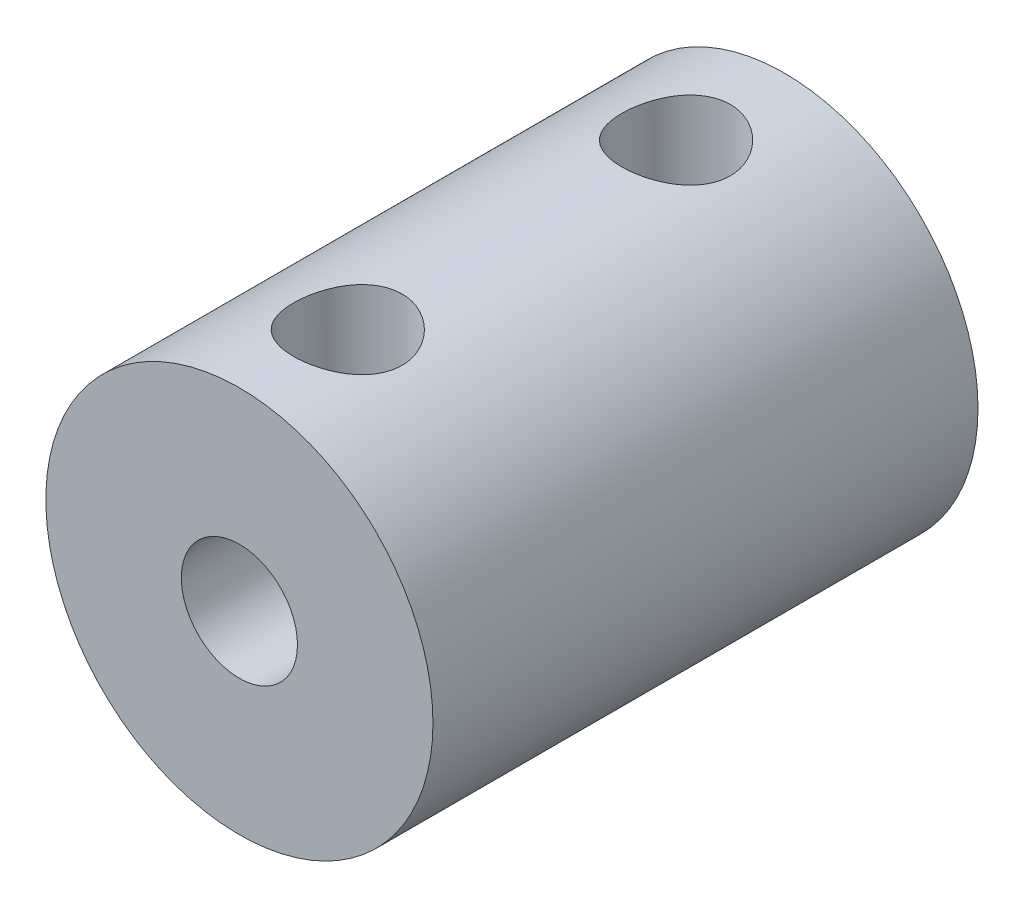
ISO-10303-21;
HEADER;
FILE_DESCRIPTION(('STEP AP214'),'2;1');
FILE_NAME('part.step','',(''),(''),'','','');
FILE_SCHEMA(('AUTOMOTIVE_DESIGN { 1 0 10303 214 1 1 1 1 }'));
ENDSEC;
DATA;
#1=APPLICATION_CONTEXT('core data for automotive mechanical design processes');
#2=APPLICATION_PROTOCOL_DEFINITION('international standard','automotive_design',2000,#1);
#3=PRODUCT_CONTEXT('',#1,'mechanical');
#4=PRODUCT('Part','Part','',(#3));
#5=PRODUCT_RELATED_PRODUCT_CATEGORY('part','',(#4));
#6=PRODUCT_DEFINITION_FORMATION('','',#4);
#7=PRODUCT_DEFINITION_CONTEXT('part definition',#1,'design');
#8=PRODUCT_DEFINITION('design','',#6,#7);
#9=PRODUCT_DEFINITION_SHAPE('','',#8);
#10=(LENGTH_UNIT() NAMED_UNIT(*) SI_UNIT(.MILLI.,.METRE.));
#11=(NAMED_UNIT(*) PLANE_ANGLE_UNIT() SI_UNIT($,.RADIAN.));
#12=(NAMED_UNIT(*) SI_UNIT($,.STERADIAN.) SOLID_ANGLE_UNIT());
#13=UNCERTAINTY_MEASURE_WITH_UNIT(LENGTH_MEASURE(1.E-05),#10,'distance_accuracy_value','');
#14=(GEOMETRIC_REPRESENTATION_CONTEXT(3) GLOBAL_UNCERTAINTY_ASSIGNED_CONTEXT((#13)) GLOBAL_UNIT_ASSIGNED_CONTEXT((#10,
#11,#12)) REPRESENTATION_CONTEXT('',''));
#15=CARTESIAN_POINT('',(0.,0.,0.));
#16=DIRECTION('',(0.,0.,1.));
#17=DIRECTION('',(1.,0.,0.));
#18=AXIS2_PLACEMENT_3D('',#15,#16,#17);
#19=CARTESIAN_POINT('',(0.,0.,22.352));
#20=DIRECTION('',(0.,0.,-1.));
#21=DIRECTION('',(-1.,0.,0.));
#22=AXIS2_PLACEMENT_3D('',#19,#20,#21);
#23=CYLINDRICAL_SURFACE('',#22,7.9375);
#24=CARTESIAN_POINT('',(0.,0.,22.352));
#25=DIRECTION('',(0.,0.,1.));
#26=DIRECTION('',(1.,0.,0.));
#27=AXIS2_PLACEMENT_3D('',#24,#25,#26);
#28=CIRCLE('',#27,7.9375);
#29=CARTESIAN_POINT('',(7.9375,0.,22.352));
#30=VERTEX_POINT('',#29);
#31=EDGE_CURVE('E12',#30,#30,#28,.T.);
#32=ORIENTED_EDGE('',*,*,#31,.F.);
#33=EDGE_LOOP('',(#32));
#34=FACE_BOUND('',#33,.T.);
#35=CARTESIAN_POINT('',(0.,0.,0.));
#36=DIRECTION('',(0.,0.,1.));
#37=DIRECTION('',(1.,0.,0.));
#38=AXIS2_PLACEMENT_3D('',#35,#36,#37);
#39=CIRCLE('',#38,7.9375);
#40=CARTESIAN_POINT('',(7.9375,0.,0.));
#41=VERTEX_POINT('',#40);
#42=EDGE_CURVE('E54',#41,#41,#39,.T.);
#43=ORIENTED_EDGE('',*,*,#42,.T.);
#44=EDGE_LOOP('',(#43));
#45=FACE_BOUND('',#44,.T.);
#46=CARTESIAN_POINT('',(0.,7.9375,2.2225));
#47=CARTESIAN_POINT('',(-0.122289434384592,7.93749841297143,2.222502398111));
#48=CARTESIAN_POINT('',(-0.24460380457482,7.93464640374844,2.23262687587564));
#49=CARTESIAN_POINT('',(-0.485694032880113,7.92354674957216,2.27277621242458));
#50=CARTESIAN_POINT('',(-0.60446842009344,7.91529689355351,2.30280922620723));
#51=CARTESIAN_POINT('',(-0.834964927090246,7.89430957331477,2.38171141204331));
#52=CARTESIAN_POINT('',(-0.946696414251323,7.88157822480584,2.43055492267656));
#53=CARTESIAN_POINT('',(-1.16038287672983,7.85296472583047,2.54559251715216));
#54=CARTESIAN_POINT('',(-1.26233693946535,7.83708228167832,2.61178821842334));
#55=CARTESIAN_POINT('',(-1.45615831068255,7.8034232726709,2.76142117544705));
#56=CARTESIAN_POINT('',(-1.54774260219952,7.78561177508401,2.84521716527189));
#57=CARTESIAN_POINT('',(-1.71575936348891,7.75032012250063,3.02690611080194));
#58=CARTESIAN_POINT('',(-1.79218966338291,7.73284001527906,3.12480108186052));
#59=CARTESIAN_POINT('',(-1.92915068426256,7.6998283677456,3.33422041664797));
#60=CARTESIAN_POINT('',(-1.98934817384267,7.68434065377252,3.44597026361879));
#61=CARTESIAN_POINT('',(-2.08998548271767,7.65758432116579,3.67850943858364));
#62=CARTESIAN_POINT('',(-2.13042936410227,7.64631483521622,3.79929690220516));
#63=CARTESIAN_POINT('',(-2.18941388458174,7.62963290719132,4.0433305685353));
#64=CARTESIAN_POINT('',(-2.20847108866752,7.62408261047198,4.16644225208111));
#65=CARTESIAN_POINT('',(-2.22575284029697,7.61905627706929,4.41423081639444));
#66=CARTESIAN_POINT('',(-2.22398171731977,7.61957897802232,4.53890736649888));
#67=CARTESIAN_POINT('',(-2.20006548936518,7.62651666080719,4.78219088560423));
#68=CARTESIAN_POINT('',(-2.17855378119358,7.63274845031214,4.90086618923935));
#69=CARTESIAN_POINT('',(-2.1167849227819,7.65010764560777,5.13285161633766));
#70=CARTESIAN_POINT('',(-2.0765261380634,7.66123547825911,5.24616127104343));
#71=CARTESIAN_POINT('',(-1.97790928071366,7.68728817952527,5.46581036825138));
#72=CARTESIAN_POINT('',(-1.9193356539467,7.7022578670799,5.57204749092034));
#73=CARTESIAN_POINT('',(-1.78590192518265,7.73428447505437,5.77340348293651));
#74=CARTESIAN_POINT('',(-1.71103832459554,7.75134184349961,5.86851995715068));
#75=CARTESIAN_POINT('',(-1.54394699344826,7.78637689551321,6.04854369025916));
#76=CARTESIAN_POINT('',(-1.45118970763094,7.80436556600566,6.13295804958312));
#77=CARTESIAN_POINT('',(-1.25261337987339,7.83868636973626,6.2851397189066));
#78=CARTESIAN_POINT('',(-1.14679371362257,7.85501842372916,6.35290623276662));
#79=CARTESIAN_POINT('',(-0.924282134935336,7.88430398837012,6.47011680307549));
#80=CARTESIAN_POINT('',(-0.807536626467184,7.89723951739796,6.51946390275543));
#81=CARTESIAN_POINT('',(-0.566959944436844,7.91814489748872,6.59768456648585));
#82=CARTESIAN_POINT('',(-0.443130491451456,7.92611594879985,6.62656307940385));
#83=CARTESIAN_POINT('',(-0.196101124919305,7.93600949314591,6.66223492193407));
#84=CARTESIAN_POINT('',(-0.0730050493447826,7.93811522289107,6.66969753237384));
#85=CARTESIAN_POINT('',(0.172682576611987,7.93657184147866,6.66418471081962));
#86=CARTESIAN_POINT('',(0.295274183312976,7.9329233912093,6.65121162593874));
#87=CARTESIAN_POINT('',(0.534031051075131,7.92040063357283,6.60574190820065));
#88=CARTESIAN_POINT('',(0.650274552968655,7.91162815516481,6.57362546036324));
#89=CARTESIAN_POINT('',(0.875707417570525,7.88985924413703,6.49122831272659));
#90=CARTESIAN_POINT('',(0.984895977260916,7.87686233168934,6.44094554945293));
#91=CARTESIAN_POINT('',(1.19566699168485,7.84766549897653,6.32244786332019));
#92=CARTESIAN_POINT('',(1.29704110514929,7.83140394678713,6.25387794200882));
#93=CARTESIAN_POINT('',(1.48707642789286,7.79755361828553,6.10119270156045));
#94=CARTESIAN_POINT('',(1.57573485369032,7.77996455266095,6.01707398796685));
#95=CARTESIAN_POINT('',(1.74069277960931,7.74475574438945,5.83254542583976));
#96=CARTESIAN_POINT('',(1.81651823498446,7.72715229446269,5.73170785802765));
#97=CARTESIAN_POINT('',(1.95019062299679,7.69450550823917,5.51836192472094));
#98=CARTESIAN_POINT('',(2.00803822741068,7.67946207629195,5.40585399552126));
#99=CARTESIAN_POINT('',(2.10368464486661,7.65381415280244,5.17286166057826));
#100=CARTESIAN_POINT('',(2.14159346282923,7.64318537493625,5.05242523518426));
#101=CARTESIAN_POINT('',(2.19651019045085,7.62758676285093,4.80653384499789));
#102=CARTESIAN_POINT('',(2.21352412253003,7.62261529808532,4.68108033702155));
#103=CARTESIAN_POINT('',(2.22579634337424,7.61904009677965,4.43359578431933));
#104=CARTESIAN_POINT('',(2.22182051126849,7.62021218162667,4.31160541699017));
#105=CARTESIAN_POINT('',(2.19402262129698,7.6282616577072,4.07010880845293));
#106=CARTESIAN_POINT('',(2.17020117735789,7.63513887245171,3.95060249051765));
#107=CARTESIAN_POINT('',(2.10385266467513,7.65368348699787,3.71854127422839));
#108=CARTESIAN_POINT('',(2.06150355593924,7.66530524566887,3.6059315866381));
#109=CARTESIAN_POINT('',(1.95943946415649,7.69202662666681,3.38932773685296));
#110=CARTESIAN_POINT('',(1.89972151088259,7.70712684374916,3.28533505215382));
#111=CARTESIAN_POINT('',(1.76236009307517,7.73971061356866,3.08530033200027));
#112=CARTESIAN_POINT('',(1.68420156559259,7.75725523110183,2.98962190181763));
#113=CARTESIAN_POINT('',(1.51313678633054,7.79242812441293,2.81249007152221));
#114=CARTESIAN_POINT('',(1.42022686792809,7.81005641993032,2.73104021868081));
#115=CARTESIAN_POINT('',(1.21957214778867,7.84392363107764,2.5827194350652));
#116=CARTESIAN_POINT('',(1.11152155583987,7.86011833953724,2.51625116374675));
#117=CARTESIAN_POINT('',(0.885326940704656,7.88879340490492,2.40252470486394));
#118=CARTESIAN_POINT('',(0.767188780236338,7.90127590062755,2.35525544990178));
#119=CARTESIAN_POINT('',(0.541420338472194,7.91970568495603,2.28669956819758));
#120=CARTESIAN_POINT('',(0.434666257171261,7.92632747266372,2.26268411699767));
#121=CARTESIAN_POINT('',(0.218614550898745,7.93522507389311,2.23058423476692));
#122=CARTESIAN_POINT('',(0.109317238511548,7.93750141868005,2.22249785627538));
#123=CARTESIAN_POINT('',(0.,7.9375,2.2225));
#124=B_SPLINE_CURVE_WITH_KNOTS('',3,(#46,#47,#48,#49,#50,#51,#52,#53,#54,#55,#56,#57,#58,#59,
#60,#61,#62,#63,#64,#65,#66,#67,#68,#69,#70,#71,#72,#73,#74,#75,#76,#77,#78,#79,#80,#81,#82,#83,
#84,#85,#86,#87,#88,#89,#90,#91,#92,#93,#94,#95,#96,#97,#98,#99,#100,#101,#102,#103,#104,#105,
#106,#107,#108,#109,#110,#111,#112,#113,#114,#115,#116,#117,#118,#119,#120,#121,#122,#123),
.UNSPECIFIED.,.T.,.F.,(4,2,2,2,2,2,2,2,2,2,2,2,2,2,2,2,2,2,2,2,2,2,2,2,2,2,2,2,2,2,2,2,2,2,2,2,
2,2,4),(0.,0.366467159375125,0.733084525040348,1.09920351015625,1.46535663402203,
1.83985902232483,2.2144149964241,2.59615815397005,2.97782277758453,3.35005588802573,
3.72221162561857,4.08282869463252,4.44347721021375,4.80854112418707,5.17368352028811,
5.55201589839115,5.93036636572644,6.310681224658,6.69090410017637,7.05910769208849,
7.42726899757707,7.78835148351942,8.14947499698045,8.51819575160419,8.88699709692384,
9.26734918477583,9.64768705833693,10.0259039435842,10.4040117918163,10.7684207028235,
11.1328183412108,11.4937902180729,11.8548238606708,12.2274771315308,12.6002231749544,
12.9820329052775,13.3636222254502,13.6912554080105,14.0188485322216),.UNSPECIFIED.);
#125=CARTESIAN_POINT('',(0.,7.9375,2.2225));
#126=VERTEX_POINT('',#125);
#127=EDGE_CURVE('E69',#126,#126,#124,.T.);
#128=ORIENTED_EDGE('',*,*,#127,.F.);
#129=EDGE_LOOP('',(#128));
#130=FACE_BOUND('',#129,.T.);
#131=CARTESIAN_POINT('',(0.,7.9375,15.6845));
#132=CARTESIAN_POINT('',(-0.122289434384591,7.93749841297143,15.684502398111));
#133=CARTESIAN_POINT('',(-0.244603804574819,7.93464640374844,15.6946268758756));
#134=CARTESIAN_POINT('',(-0.485694032880112,7.92354674957216,15.7347762124246));
#135=CARTESIAN_POINT('',(-0.604468420093439,7.91529689355351,15.7648092262072));
#136=CARTESIAN_POINT('',(-0.834964927090245,7.89430957331477,15.8437114120433));
#137=CARTESIAN_POINT('',(-0.946696414251322,7.88157822480584,15.8925549226766));
#138=CARTESIAN_POINT('',(-1.16038287672983,7.85296472583047,16.0075925171522));
#139=CARTESIAN_POINT('',(-1.26233693946535,7.83708228167832,16.0737882184233));
#140=CARTESIAN_POINT('',(-1.45615831068255,7.8034232726709,16.223421175447));
#141=CARTESIAN_POINT('',(-1.54774260219952,7.78561177508401,16.3072171652719));
#142=CARTESIAN_POINT('',(-1.7157593634889,7.75032012250063,16.4889061108019));
#143=CARTESIAN_POINT('',(-1.79218966338291,7.73284001527906,16.5868010818605));
#144=CARTESIAN_POINT('',(-1.92915068426256,7.6998283677456,16.796220416648));
#145=CARTESIAN_POINT('',(-1.98934817384267,7.68434065377252,16.9079702636188));
#146=CARTESIAN_POINT('',(-2.08998548271766,7.65758432116579,17.1405094385836));
#147=CARTESIAN_POINT('',(-2.13042936410227,7.64631483521622,17.2612969022052));
#148=CARTESIAN_POINT('',(-2.18941388458174,7.62963290719132,17.5053305685353));
#149=CARTESIAN_POINT('',(-2.20847108866751,7.62408261047198,17.6284422520811));
#150=CARTESIAN_POINT('',(-2.22575284029697,7.61905627706929,17.8762308163944));
#151=CARTESIAN_POINT('',(-2.22398171731976,7.61957897802232,18.0009073664989));
#152=CARTESIAN_POINT('',(-2.20006548936518,7.62651666080719,18.2441908856042));
#153=CARTESIAN_POINT('',(-2.17855378119358,7.63274845031214,18.3628661892393));
#154=CARTESIAN_POINT('',(-2.1167849227819,7.65010764560777,18.5948516163377));
#155=CARTESIAN_POINT('',(-2.07652613806339,7.66123547825911,18.7081612710434));
#156=CARTESIAN_POINT('',(-1.97790928071366,7.68728817952527,18.9278103682514));
#157=CARTESIAN_POINT('',(-1.9193356539467,7.7022578670799,19.0340474909203));
#158=CARTESIAN_POINT('',(-1.78590192518265,7.73428447505437,19.2354034829365));
#159=CARTESIAN_POINT('',(-1.71103832459554,7.75134184349961,19.3305199571507));
#160=CARTESIAN_POINT('',(-1.54394699344826,7.78637689551321,19.5105436902592));
#161=CARTESIAN_POINT('',(-1.45118970763094,7.80436556600566,19.5949580495831));
#162=CARTESIAN_POINT('',(-1.25261337987339,7.83868636973626,19.7471397189066));
#163=CARTESIAN_POINT('',(-1.14679371362257,7.85501842372916,19.8149062327666));
#164=CARTESIAN_POINT('',(-0.924282134935334,7.88430398837012,19.9321168030755));
#165=CARTESIAN_POINT('',(-0.807536626467182,7.89723951739796,19.9814639027554));
#166=CARTESIAN_POINT('',(-0.566959944436842,7.91814489748872,20.0596845664858));
#167=CARTESIAN_POINT('',(-0.443130491451454,7.92611594879985,20.0885630794039));
#168=CARTESIAN_POINT('',(-0.196101124919303,7.93600949314591,20.1242349219341));
#169=CARTESIAN_POINT('',(-0.073005049344781,7.93811522289107,20.1316975323738));
#170=CARTESIAN_POINT('',(0.172682576611989,7.93657184147866,20.1261847108196));
#171=CARTESIAN_POINT('',(0.295274183312978,7.9329233912093,20.1132116259387));
#172=CARTESIAN_POINT('',(0.534031051075135,7.92040063357283,20.0677419082006));
#173=CARTESIAN_POINT('',(0.65027455296866,7.91162815516481,20.0356254603632));
#174=CARTESIAN_POINT('',(0.875707417570529,7.88985924413703,19.9532283127266));
#175=CARTESIAN_POINT('',(0.984895977260919,7.87686233168934,19.9029455494529));
#176=CARTESIAN_POINT('',(1.19566699168485,7.84766549897653,19.7844478633202));
#177=CARTESIAN_POINT('',(1.2970411051493,7.83140394678713,19.7158779420088));
#178=CARTESIAN_POINT('',(1.48707642789286,7.79755361828553,19.5631927015604));
#179=CARTESIAN_POINT('',(1.57573485369032,7.77996455266095,19.4790739879668));
#180=CARTESIAN_POINT('',(1.74069277960931,7.74475574438944,19.2945454258398));
#181=CARTESIAN_POINT('',(1.81651823498446,7.72715229446269,19.1937078580276));
#182=CARTESIAN_POINT('',(1.95019062299679,7.69450550823917,18.9803619247209));
#183=CARTESIAN_POINT('',(2.00803822741068,7.67946207629195,18.8678539955213));
#184=CARTESIAN_POINT('',(2.10368464486661,7.65381415280244,18.6348616605783));
#185=CARTESIAN_POINT('',(2.14159346282924,7.64318537493625,18.5144252351843));
#186=CARTESIAN_POINT('',(2.19651019045085,7.62758676285093,18.2685338449979));
#187=CARTESIAN_POINT('',(2.21352412253003,7.62261529808532,18.1430803370216));
#188=CARTESIAN_POINT('',(2.22579634337424,7.61904009677965,17.8955957843193));
#189=CARTESIAN_POINT('',(2.22182051126849,7.62021218162667,17.7736054169902));
#190=CARTESIAN_POINT('',(2.19402262129698,7.6282616577072,17.5321088084529));
#191=CARTESIAN_POINT('',(2.1702011773579,7.63513887245171,17.4126024905176));
#192=CARTESIAN_POINT('',(2.10385266467514,7.65368348699787,17.1805412742284));
#193=CARTESIAN_POINT('',(2.06150355593924,7.66530524566887,17.0679315866381));
#194=CARTESIAN_POINT('',(1.95943946415649,7.69202662666681,16.851327736853));
#195=CARTESIAN_POINT('',(1.89972151088259,7.70712684374916,16.7473350521538));
#196=CARTESIAN_POINT('',(1.76236009307517,7.73971061356866,16.5473003320003));
#197=CARTESIAN_POINT('',(1.68420156559259,7.75725523110183,16.4516219018176));
#198=CARTESIAN_POINT('',(1.51313678633054,7.79242812441293,16.2744900715222));
#199=CARTESIAN_POINT('',(1.42022686792809,7.81005641993032,16.1930402186808));
#200=CARTESIAN_POINT('',(1.21957214778867,7.84392363107764,16.0447194350652));
#201=CARTESIAN_POINT('',(1.11152155583987,7.86011833953724,15.9782511637467));
#202=CARTESIAN_POINT('',(0.885326940704655,7.88879340490492,15.8645247048639));
#203=CARTESIAN_POINT('',(0.767188780236338,7.90127590062755,15.8172554499018));
#204=CARTESIAN_POINT('',(0.541420338472195,7.91970568495603,15.7486995681976));
#205=CARTESIAN_POINT('',(0.434666257171261,7.92632747266372,15.7246841169977));
#206=CARTESIAN_POINT('',(0.218614550898745,7.93522507389311,15.6925842347669));
#207=CARTESIAN_POINT('',(0.109317238511548,7.93750141868005,15.6844978562754));
#208=CARTESIAN_POINT('',(0.,7.9375,15.6845));
#209=B_SPLINE_CURVE_WITH_KNOTS('',3,(#131,#132,#133,#134,#135,#136,#137,#138,#139,#140,#141,
#142,#143,#144,#145,#146,#147,#148,#149,#150,#151,#152,#153,#154,#155,#156,#157,#158,#159,#160,
#161,#162,#163,#164,#165,#166,#167,#168,#169,#170,#171,#172,#173,#174,#175,#176,#177,#178,#179,
#180,#181,#182,#183,#184,#185,#186,#187,#188,#189,#190,#191,#192,#193,#194,#195,#196,#197,#198,
#199,#200,#201,#202,#203,#204,#205,#206,#207,#208),.UNSPECIFIED.,.T.,.F.,(4,2,2,2,2,2,2,2,2,2,2,
2,2,2,2,2,2,2,2,2,2,2,2,2,2,2,2,2,2,2,2,2,2,2,2,2,2,2,4),(0.,0.366467159375125,
0.733084525040349,1.09920351015625,1.46535663402203,1.83985902232483,2.2144149964241,
2.59615815397005,2.97782277758453,3.35005588802573,3.72221162561857,4.08282869463253,
4.44347721021375,4.80854112418707,5.17368352028811,5.55201589839115,5.93036636572644,
6.310681224658,6.69090410017637,7.05910769208849,7.42726899757707,7.78835148351942,
8.14947499698046,8.5181957516042,8.88699709692385,9.26734918477583,9.64768705833693,
10.0259039435842,10.4040117918163,10.7684207028235,11.1328183412108,11.4937902180729,
11.8548238606708,12.2274771315308,12.6002231749544,12.9820329052775,13.3636222254502,
13.6912554080105,14.0188485322216),.UNSPECIFIED.);
#210=CARTESIAN_POINT('',(0.,7.9375,15.6845));
#211=VERTEX_POINT('',#210);
#212=EDGE_CURVE('E70',#211,#211,#209,.T.);
#213=ORIENTED_EDGE('',*,*,#212,.F.);
#214=EDGE_LOOP('',(#213));
#215=FACE_BOUND('',#214,.T.);
#216=ADVANCED_FACE('F42',(#34,#45,#130,#215),#23,.T.);
#217=CARTESIAN_POINT('',(0.,0.,0.));
#218=DIRECTION('',(0.,0.,1.));
#219=DIRECTION('',(1.,0.,0.));
#220=AXIS2_PLACEMENT_3D('',#217,#218,#219);
#221=CYLINDRICAL_SURFACE('',#220,2.38125);
#222=CARTESIAN_POINT('',(0.,2.38125,2.2225));
#223=CARTESIAN_POINT('',(0.10175093640361,2.38124703022677,2.22250300685196));
#224=CARTESIAN_POINT('',(0.203522692147452,2.37467420005168,2.22954117476645));
#225=CARTESIAN_POINT('',(0.403592509755524,2.34897030551855,2.25711507726185));
#226=CARTESIAN_POINT('',(0.501888097944402,2.32983048061234,2.27766022767637));
#227=CARTESIAN_POINT('',(0.691600173612992,2.28070009975167,2.33056315654022));
#228=CARTESIAN_POINT('',(0.783055845182337,2.2507781661883,2.36284624075312));
#229=CARTESIAN_POINT('',(0.958129046007172,2.18201795301847,2.43737379150318));
#230=CARTESIAN_POINT('',(1.04174466527685,2.14317750860066,2.47962067664505));
#231=CARTESIAN_POINT('',(1.23251028258521,2.0413763640653,2.59106374385985));
#232=CARTESIAN_POINT('',(1.33550632105848,1.9750128476514,2.66424971401401));
#233=CARTESIAN_POINT('',(1.52451121031219,1.83309773958082,2.82305647482055));
#234=CARTESIAN_POINT('',(1.61046222352526,1.75751622413426,2.9087179484772));
#235=CARTESIAN_POINT('',(1.73687732809426,1.63046052625932,3.05633586758315));
#236=CARTESIAN_POINT('',(1.78239490885965,1.58043124405963,3.11531429219639));
#237=CARTESIAN_POINT('',(1.86705504965452,1.47945784622329,3.23706083207311));
#238=CARTESIAN_POINT('',(1.90619289486492,1.42851308461185,3.29983170353551));
#239=CARTESIAN_POINT('',(1.97807638343489,1.32718255402696,3.42903961233565));
#240=CARTESIAN_POINT('',(2.01083804174594,1.2767956923735,3.49546691252317));
#241=CARTESIAN_POINT('',(2.07005973751693,1.17833762917068,3.63263119045582));
#242=CARTESIAN_POINT('',(2.0965281993105,1.13026340143066,3.70336224579459));
#243=CARTESIAN_POINT('',(2.1361140257618,1.05293591867363,3.82896508584095));
#244=CARTESIAN_POINT('',(2.15087387186558,1.02228255734714,3.88244627631111));
#245=CARTESIAN_POINT('',(2.17675520249747,0.965940986895705,3.99283622507745));
#246=CARTESIAN_POINT('',(2.18788124040624,0.940246580554252,4.0497405871722));
#247=CARTESIAN_POINT('',(2.20409764813081,0.901477078263094,4.15564993773872));
#248=CARTESIAN_POINT('',(2.20994884415512,0.886907772156764,4.20397039303806));
#249=CARTESIAN_POINT('',(2.21847420981416,0.865369450668072,4.302500809186));
#250=CARTESIAN_POINT('',(2.22115779507425,0.858377915686602,4.35270471017004));
#251=CARTESIAN_POINT('',(2.2230615673394,0.853439995647803,4.45399283173746));
#252=CARTESIAN_POINT('',(2.2222584448165,0.855554485926306,4.5050806958763));
#253=CARTESIAN_POINT('',(2.21723973887413,0.868470483796378,4.60600965295542));
#254=CARTESIAN_POINT('',(2.21301616018428,0.879292344365349,4.65584754238874));
#255=CARTESIAN_POINT('',(2.19903300274284,0.913823347824142,4.77482924305952));
#256=CARTESIAN_POINT('',(2.18764593870351,0.941124954195303,4.84269025265034));
#257=CARTESIAN_POINT('',(2.15975186362473,1.00349291124993,4.97367770643234));
#258=CARTESIAN_POINT('',(2.14322249950858,1.03859296684691,5.03678195613209));
#259=CARTESIAN_POINT('',(2.10426708479824,1.11553059057773,5.16351470200321));
#260=CARTESIAN_POINT('',(2.08150041482621,1.15767212997307,5.22684953385439));
#261=CARTESIAN_POINT('',(2.03099570790849,1.24415673741467,5.34998200473649));
#262=CARTESIAN_POINT('',(2.00325290075974,1.28850188812607,5.40977617582737));
#263=CARTESIAN_POINT('',(1.9428096023593,1.37795587124386,5.52634594123569));
#264=CARTESIAN_POINT('',(1.91010265994262,1.42306562853032,5.58311747586937));
#265=CARTESIAN_POINT('',(1.83969796232473,1.51298640617418,5.69372568976607));
#266=CARTESIAN_POINT('',(1.80200002256375,1.55779741541991,5.74756226039443));
#267=CARTESIAN_POINT('',(1.71810055207976,1.65005586497754,5.85664974219327));
#268=CARTESIAN_POINT('',(1.67145077533637,1.69740871180895,5.91163979426498));
#269=CARTESIAN_POINT('',(1.57201183669742,1.78990494594871,6.01776397837092));
#270=CARTESIAN_POINT('',(1.51922066661582,1.83504760364828,6.06889684007448));
#271=CARTESIAN_POINT('',(1.35170197347936,1.96548883310393,6.21539318146275));
#272=CARTESIAN_POINT('',(1.22738241819897,2.04631555316656,6.30445063226099));
#273=CARTESIAN_POINT('',(1.00747021032518,2.15967549730076,6.4283542277097));
#274=CARTESIAN_POINT('',(0.919474347033364,2.19877280463021,6.47082128879185));
#275=CARTESIAN_POINT('',(0.735270787699571,2.26701098288164,6.54469002252412));
#276=CARTESIAN_POINT('',(0.639068972438682,2.29615891031522,6.57609953814054));
#277=CARTESIAN_POINT('',(0.439711046724101,2.3425521594942,6.62600657497642));
#278=CARTESIAN_POINT('',(0.336506964491798,2.3597038150824,6.64440249931548));
#279=CARTESIAN_POINT('',(0.127184439534057,2.38016923890392,6.66634577623404));
#280=CARTESIAN_POINT('',(0.0210679015787514,2.3834918441466,6.66990261125923));
#281=CARTESIAN_POINT('',(-0.177916853106249,2.37643934699634,6.66234502526834));
#282=CARTESIAN_POINT('',(-0.270910080724627,2.36758989960981,6.65286471859373));
#283=CARTESIAN_POINT('',(-0.453427878738518,2.33950482769181,6.62272070657175));
#284=CARTESIAN_POINT('',(-0.542951877321729,2.32026749872593,6.60205516595977));
#285=CARTESIAN_POINT('',(-0.717660101600377,2.27236414192199,6.55044224211502));
#286=CARTESIAN_POINT('',(-0.802770241390369,2.24357541162075,6.51936099791592));
#287=CARTESIAN_POINT('',(-0.96606585274343,2.17825962930284,6.44853599467746));
#288=CARTESIAN_POINT('',(-1.04424948571521,2.14173053133712,6.40878994525967));
#289=CARTESIAN_POINT('',(-1.23016206684754,2.04279021033544,6.30049190223977));
#290=CARTESIAN_POINT('',(-1.33323828796586,1.97654393669676,6.22744647696719));
#291=CARTESIAN_POINT('',(-1.52243299636872,1.83482695766989,6.06889570116582));
#292=CARTESIAN_POINT('',(-1.60848953450069,1.75932411771221,5.98334673465722));
#293=CARTESIAN_POINT('',(-1.73511164262584,1.63234184813389,5.83587153971055));
#294=CARTESIAN_POINT('',(-1.78072466062733,1.58231546854914,5.77692324630929));
#295=CARTESIAN_POINT('',(-1.86556957329411,1.4813334350545,5.65523398123252));
#296=CARTESIAN_POINT('',(-1.90479675296249,1.43037712512296,5.59249025365165));
#297=CARTESIAN_POINT('',(-1.97685228195261,1.3290081416155,5.46334117723377));
#298=CARTESIAN_POINT('',(-2.00969697437745,1.27859440034088,5.39694575429892));
#299=CARTESIAN_POINT('',(-2.06908318572349,1.1800553746365,5.25985287180625));
#300=CARTESIAN_POINT('',(-2.09563306148541,1.13192712474347,5.18916127426063));
#301=CARTESIAN_POINT('',(-2.13537479052786,1.05443792597089,5.0635952994476));
#302=CARTESIAN_POINT('',(-2.15020547948167,1.02369158874009,5.01010529939493));
#303=CARTESIAN_POINT('',(-2.17622807626879,0.967132098649388,4.89969747274186));
#304=CARTESIAN_POINT('',(-2.18742434552598,0.941313048337647,4.84278385259124));
#305=CARTESIAN_POINT('',(-2.20377786311248,0.902261704097733,4.73678884763202));
#306=CARTESIAN_POINT('',(-2.20969219824257,0.887549002470735,4.68839066818038));
#307=CARTESIAN_POINT('',(-2.21833498777709,0.865728342924982,4.58968190893422));
#308=CARTESIAN_POINT('',(-2.22107298682479,0.858597607205246,4.53937753006225));
#309=CARTESIAN_POINT('',(-2.22307107366976,0.853415791470576,4.43784982431729));
#310=CARTESIAN_POINT('',(-2.22230705506794,0.8554276443299,4.38662255307376));
#311=CARTESIAN_POINT('',(-2.21734533537028,0.868200178292049,4.28540561882749));
#312=CARTESIAN_POINT('',(-2.21313959992197,0.878981330112096,4.23541913392988));
#313=CARTESIAN_POINT('',(-2.19921774939739,0.913375472173685,4.11643663894929));
#314=CARTESIAN_POINT('',(-2.18789493086271,0.940540512607069,4.04870409515304));
#315=CARTESIAN_POINT('',(-2.16014720313488,1.00263624033578,3.91795693829437));
#316=CARTESIAN_POINT('',(-2.14370004933945,1.03760059254872,3.85496441095309));
#317=CARTESIAN_POINT('',(-2.10492929622347,1.11427411110069,3.72843930250362));
#318=CARTESIAN_POINT('',(-2.08226527920257,1.15628888969695,3.66520071018494));
#319=CARTESIAN_POINT('',(-2.03198600033109,1.24253221170509,3.54225318110689));
#320=CARTESIAN_POINT('',(-2.00436597688463,1.28676285433898,3.48254771288902));
#321=CARTESIAN_POINT('',(-1.94419006733198,1.37600101553462,3.366146292857));
#322=CARTESIAN_POINT('',(-1.9116277460786,1.4210094781506,3.3094543967545));
#323=CARTESIAN_POINT('',(-1.84153546243536,1.51074293082683,3.19899339210907));
#324=CARTESIAN_POINT('',(-1.80400530662861,1.55546790977889,3.14522439748098));
#325=CARTESIAN_POINT('',(-1.72043753004496,1.64761403020163,3.03620435726982));
#326=CARTESIAN_POINT('',(-1.67394779904264,1.69494090465768,2.98121629095965));
#327=CARTESIAN_POINT('',(-1.57484605598663,1.78740668724072,2.87507912614266));
#328=CARTESIAN_POINT('',(-1.52223203591466,1.83254487083397,2.82393129585751));
#329=CARTESIAN_POINT('',(-1.35525812345594,1.96301920267744,2.67734677450458));
#330=CARTESIAN_POINT('',(-1.2313301166566,2.04391916999333,2.58818509851484));
#331=CARTESIAN_POINT('',(-1.01184539053484,2.15763323086052,2.46386872750825));
#332=CARTESIAN_POINT('',(-0.92384940660723,2.19694458005971,2.42116251562618));
#333=CARTESIAN_POINT('',(-0.739623618938463,2.26559548680763,2.34683765535438));
#334=CARTESIAN_POINT('',(-0.643403991693722,2.29494715173861,2.31520554335917));
#335=CARTESIAN_POINT('',(-0.456725687851755,2.33876301385191,2.2680682845365));
#336=CARTESIAN_POINT('',(-0.366964280067111,2.35459240772435,2.25108191932985));
#337=CARTESIAN_POINT('',(-0.184807268304142,2.37583615764941,2.22829758444011));
#338=CARTESIAN_POINT('',(-0.0924122207069671,2.38125269720701,2.22249726911735));
#339=CARTESIAN_POINT('',(0.,2.38125,2.2225));
#340=B_SPLINE_CURVE_WITH_KNOTS('',3,(#222,#223,#224,#225,#226,#227,#228,#229,#230,#231,#232,
#233,#234,#235,#236,#237,#238,#239,#240,#241,#242,#243,#244,#245,#246,#247,#248,#249,#250,#251,
#252,#253,#254,#255,#256,#257,#258,#259,#260,#261,#262,#263,#264,#265,#266,#267,#268,#269,#270,
#271,#272,#273,#274,#275,#276,#277,#278,#279,#280,#281,#282,#283,#284,#285,#286,#287,#288,#289,
#290,#291,#292,#293,#294,#295,#296,#297,#298,#299,#300,#301,#302,#303,#304,#305,#306,#307,#308,
#309,#310,#311,#312,#313,#314,#315,#316,#317,#318,#319,#320,#321,#322,#323,#324,#325,#326,#327,
#328,#329,#330,#331,#332,#333,#334,#335,#336,#337,#338,#339),.UNSPECIFIED.,.T.,.F.,(4,2,2,2,2,2,
2,2,2,2,2,2,2,2,2,2,2,2,2,2,2,2,2,2,2,2,2,2,2,2,2,2,2,2,2,2,2,2,2,2,2,2,2,2,2,2,2,2,2,2,2,2,2,2,
2,2,2,2,4),(0.,0.304855553193616,0.609923849479403,0.913083882441653,1.21631758009444,
1.64215709590017,2.06941774424172,2.33835724760266,2.60749461308448,2.87594701116928,
3.14403799858385,3.33394461360789,3.52361234297388,3.67549714496655,3.82692932794442,
3.9793754268592,4.13217889854741,4.35300911562226,4.57481299893595,4.81269716176824,
5.05081059483546,5.28923616162671,5.52767054750953,5.78612694775913,6.04466809998172,
6.55906983427965,6.87367682425346,7.18806021604599,7.50487168782134,7.8214806803145,
8.10181768694833,8.38220070501312,8.6663349466379,8.95054438507305,9.37615145650551,
9.80328026264735,10.072299380053,10.3415162361041,10.6100343746765,10.8781940138539,
11.0683091066204,11.2581952042442,11.4104484172617,11.5622429263406,11.7150838873098,
11.8682826618373,12.0885826919461,12.3098526857321,12.547217141997,12.7848108847058,
13.022716684514,13.2606317496354,13.5187842707019,13.7770216739379,14.2908733092229,
14.6060177286276,14.9207776620294,15.1977116058563,15.4745874721748),.UNSPECIFIED.);
#341=CARTESIAN_POINT('',(0.,2.38125,2.2225));
#342=VERTEX_POINT('',#341);
#343=EDGE_CURVE('E64',#342,#342,#340,.T.);
#344=ORIENTED_EDGE('',*,*,#343,.F.);
#345=EDGE_LOOP('',(#344));
#346=FACE_BOUND('',#345,.T.);
#347=CARTESIAN_POINT('',(0.,0.,0.));
#348=DIRECTION('',(0.,0.,1.));
#349=DIRECTION('',(1.,0.,0.));
#350=AXIS2_PLACEMENT_3D('',#347,#348,#349);
#351=CIRCLE('',#350,2.38125);
#352=CARTESIAN_POINT('',(2.38125,0.,0.));
#353=VERTEX_POINT('',#352);
#354=EDGE_CURVE('E59',#353,#353,#351,.T.);
#355=ORIENTED_EDGE('',*,*,#354,.F.);
#356=EDGE_LOOP('',(#355));
#357=FACE_BOUND('',#356,.T.);
#358=CARTESIAN_POINT('',(0.,0.,22.352));
#359=DIRECTION('',(0.,0.,1.));
#360=DIRECTION('',(1.,0.,0.));
#361=AXIS2_PLACEMENT_3D('',#358,#359,#360);
#362=CIRCLE('',#361,2.38125);
#363=CARTESIAN_POINT('',(2.38125,0.,22.352));
#364=VERTEX_POINT('',#363);
#365=EDGE_CURVE('E62',#364,#364,#362,.T.);
#366=ORIENTED_EDGE('',*,*,#365,.T.);
#367=EDGE_LOOP('',(#366));
#368=FACE_BOUND('',#367,.T.);
#369=CARTESIAN_POINT('',(0.,2.38125,15.6845));
#370=CARTESIAN_POINT('',(0.101750936403611,2.38124703022677,15.684503006852));
#371=CARTESIAN_POINT('',(0.203522692147453,2.37467420005168,15.6915411747665));
#372=CARTESIAN_POINT('',(0.403592509755525,2.34897030551855,15.7191150772619));
#373=CARTESIAN_POINT('',(0.501888097944403,2.32983048061234,15.7396602276764));
#374=CARTESIAN_POINT('',(0.691600173612993,2.28070009975167,15.7925631565402));
#375=CARTESIAN_POINT('',(0.783055845182337,2.2507781661883,15.8248462407531));
#376=CARTESIAN_POINT('',(0.958129046007173,2.18201795301847,15.8993737915032));
#377=CARTESIAN_POINT('',(1.04174466527685,2.14317750860066,15.9416206766451));
#378=CARTESIAN_POINT('',(1.23251028258522,2.0413763640653,16.0530637438598));
#379=CARTESIAN_POINT('',(1.33550632105849,1.9750128476514,16.126249714014));
#380=CARTESIAN_POINT('',(1.52451121031219,1.83309773958082,16.2850564748205));
#381=CARTESIAN_POINT('',(1.61046222352526,1.75751622413426,16.3707179484772));
#382=CARTESIAN_POINT('',(1.73687732809426,1.63046052625932,16.5183358675832));
#383=CARTESIAN_POINT('',(1.78239490885965,1.58043124405963,16.5773142921964));
#384=CARTESIAN_POINT('',(1.86705504965452,1.47945784622329,16.6990608320731));
#385=CARTESIAN_POINT('',(1.90619289486492,1.42851308461184,16.7618317035355));
#386=CARTESIAN_POINT('',(1.97807638343489,1.32718255402696,16.8910396123357));
#387=CARTESIAN_POINT('',(2.01083804174594,1.2767956923735,16.9574669125232));
#388=CARTESIAN_POINT('',(2.07005973751693,1.17833762917067,17.0946311904558));
#389=CARTESIAN_POINT('',(2.0965281993105,1.13026340143066,17.1653622457946));
#390=CARTESIAN_POINT('',(2.1361140257618,1.05293591867363,17.290965085841));
#391=CARTESIAN_POINT('',(2.15087387186559,1.02228255734714,17.3444462763111));
#392=CARTESIAN_POINT('',(2.17675520249747,0.965940986895699,17.4548362250775));
#393=CARTESIAN_POINT('',(2.18788124040624,0.940246580554246,17.5117405871722));
#394=CARTESIAN_POINT('',(2.20409764813081,0.901477078263089,17.6176499377387));
#395=CARTESIAN_POINT('',(2.20994884415512,0.886907772156758,17.6659703930381));
#396=CARTESIAN_POINT('',(2.21847420981416,0.865369450668066,17.764500809186));
#397=CARTESIAN_POINT('',(2.22115779507425,0.858377915686598,17.81470471017));
#398=CARTESIAN_POINT('',(2.2230615673394,0.8534399956478,17.9159928317375));
#399=CARTESIAN_POINT('',(2.2222584448165,0.855554485926304,17.9670806958763));
#400=CARTESIAN_POINT('',(2.21723973887414,0.868470483796377,18.0680096529554));
#401=CARTESIAN_POINT('',(2.21301616018428,0.879292344365347,18.1178475423887));
#402=CARTESIAN_POINT('',(2.19903300274284,0.913823347824139,18.2368292430595));
#403=CARTESIAN_POINT('',(2.18764593870351,0.9411249541953,18.3046902526503));
#404=CARTESIAN_POINT('',(2.15975186362473,1.00349291124992,18.4356777064323));
#405=CARTESIAN_POINT('',(2.14322249950858,1.0385929668469,18.4987819561321));
#406=CARTESIAN_POINT('',(2.10426708479824,1.11553059057773,18.6255147020032));
#407=CARTESIAN_POINT('',(2.08150041482621,1.15767212997306,18.6888495338544));
#408=CARTESIAN_POINT('',(2.03099570790849,1.24415673741467,18.8119820047365));
#409=CARTESIAN_POINT('',(2.00325290075974,1.28850188812606,18.8717761758274));
#410=CARTESIAN_POINT('',(1.9428096023593,1.37795587124385,18.9883459412357));
#411=CARTESIAN_POINT('',(1.91010265994262,1.42306562853032,19.0451174758694));
#412=CARTESIAN_POINT('',(1.83969796232473,1.51298640617418,19.1557256897661));
#413=CARTESIAN_POINT('',(1.80200002256375,1.55779741541991,19.2095622603944));
#414=CARTESIAN_POINT('',(1.71810055207976,1.65005586497754,19.3186497421933));
#415=CARTESIAN_POINT('',(1.67145077533637,1.69740871180895,19.373639794265));
#416=CARTESIAN_POINT('',(1.57201183669742,1.78990494594871,19.4797639783709));
#417=CARTESIAN_POINT('',(1.51922066661582,1.83504760364828,19.5308968400745));
#418=CARTESIAN_POINT('',(1.35170197347936,1.96548883310393,19.6773931814627));
#419=CARTESIAN_POINT('',(1.22738241819898,2.04631555316656,19.766450632261));
#420=CARTESIAN_POINT('',(1.00747021032519,2.15967549730076,19.8903542277097));
#421=CARTESIAN_POINT('',(0.919474347033368,2.19877280463021,19.9328212887918));
#422=CARTESIAN_POINT('',(0.735270787699574,2.26701098288163,20.0066900225241));
#423=CARTESIAN_POINT('',(0.639068972438686,2.29615891031522,20.0380995381405));
#424=CARTESIAN_POINT('',(0.439711046724105,2.3425521594942,20.0880065749764));
#425=CARTESIAN_POINT('',(0.336506964491803,2.3597038150824,20.1064024993155));
#426=CARTESIAN_POINT('',(0.127184439534062,2.38016923890392,20.128345776234));
#427=CARTESIAN_POINT('',(0.0210679015787555,2.3834918441466,20.1319026112592));
#428=CARTESIAN_POINT('',(-0.177916853106245,2.37643934699634,20.1243450252683));
#429=CARTESIAN_POINT('',(-0.270910080724622,2.36758989960981,20.1148647185937));
#430=CARTESIAN_POINT('',(-0.453427878738514,2.33950482769181,20.0847207065717));
#431=CARTESIAN_POINT('',(-0.542951877321725,2.32026749872593,20.0640551659598));
#432=CARTESIAN_POINT('',(-0.717660101600374,2.272364141922,20.012442242115));
#433=CARTESIAN_POINT('',(-0.802770241390366,2.24357541162075,19.9813609979159));
#434=CARTESIAN_POINT('',(-0.966065852743426,2.17825962930284,19.9105359946775));
#435=CARTESIAN_POINT('',(-1.0442494857152,2.14173053133712,19.8707899452597));
#436=CARTESIAN_POINT('',(-1.23016206684753,2.04279021033545,19.7624919022398));
#437=CARTESIAN_POINT('',(-1.33323828796586,1.97654393669676,19.6894464769672));
#438=CARTESIAN_POINT('',(-1.52243299636872,1.83482695766989,19.5308957011658));
#439=CARTESIAN_POINT('',(-1.60848953450069,1.75932411771221,19.4453467346572));
#440=CARTESIAN_POINT('',(-1.73511164262584,1.63234184813389,19.2978715397105));
#441=CARTESIAN_POINT('',(-1.78072466062733,1.58231546854914,19.2389232463093));
#442=CARTESIAN_POINT('',(-1.86556957329412,1.4813334350545,19.1172339812325));
#443=CARTESIAN_POINT('',(-1.90479675296249,1.43037712512296,19.0544902536517));
#444=CARTESIAN_POINT('',(-1.97685228195261,1.3290081416155,18.9253411772338));
#445=CARTESIAN_POINT('',(-2.00969697437745,1.27859440034088,18.8589457542989));
#446=CARTESIAN_POINT('',(-2.06908318572349,1.1800553746365,18.7218528718062));
#447=CARTESIAN_POINT('',(-2.09563306148541,1.13192712474347,18.6511612742606));
#448=CARTESIAN_POINT('',(-2.13537479052786,1.0544379259709,18.5255952994476));
#449=CARTESIAN_POINT('',(-2.15020547948167,1.02369158874009,18.4721052993949));
#450=CARTESIAN_POINT('',(-2.17622807626879,0.96713209864939,18.3616974727419));
#451=CARTESIAN_POINT('',(-2.18742434552598,0.941313048337649,18.3047838525912));
#452=CARTESIAN_POINT('',(-2.20377786311248,0.902261704097735,18.198788847632));
#453=CARTESIAN_POINT('',(-2.20969219824257,0.887549002470737,18.1503906681804));
#454=CARTESIAN_POINT('',(-2.21833498777709,0.865728342924984,18.0516819089342));
#455=CARTESIAN_POINT('',(-2.22107298682479,0.858597607205249,18.0013775300622));
#456=CARTESIAN_POINT('',(-2.22307107366976,0.85341579147058,17.8998498243173));
#457=CARTESIAN_POINT('',(-2.22230705506793,0.855427644329904,17.8486225530738));
#458=CARTESIAN_POINT('',(-2.21734533537028,0.868200178292052,17.7474056188275));
#459=CARTESIAN_POINT('',(-2.21313959992197,0.878981330112099,17.6974191339299));
#460=CARTESIAN_POINT('',(-2.19921774939738,0.913375472173689,17.5784366389493));
#461=CARTESIAN_POINT('',(-2.18789493086271,0.940540512607074,17.510704095153));
#462=CARTESIAN_POINT('',(-2.16014720313488,1.00263624033579,17.3799569382944));
#463=CARTESIAN_POINT('',(-2.14370004933944,1.03760059254872,17.3169644109531));
#464=CARTESIAN_POINT('',(-2.10492929622347,1.1142741111007,17.1904393025036));
#465=CARTESIAN_POINT('',(-2.08226527920257,1.15628888969696,17.1272007101849));
#466=CARTESIAN_POINT('',(-2.03198600033109,1.2425322117051,17.0042531811069));
#467=CARTESIAN_POINT('',(-2.00436597688463,1.28676285433899,16.944547712889));
#468=CARTESIAN_POINT('',(-1.94419006733197,1.37600101553463,16.828146292857));
#469=CARTESIAN_POINT('',(-1.9116277460786,1.42100947815061,16.7714543967545));
#470=CARTESIAN_POINT('',(-1.84153546243536,1.51074293082684,16.6609933921091));
#471=CARTESIAN_POINT('',(-1.8040053066286,1.5554679097789,16.607224397481));
#472=CARTESIAN_POINT('',(-1.72043753004495,1.64761403020164,16.4982043572698));
#473=CARTESIAN_POINT('',(-1.67394779904263,1.69494090465769,16.4432162909596));
#474=CARTESIAN_POINT('',(-1.57484605598662,1.78740668724073,16.3370791261426));
#475=CARTESIAN_POINT('',(-1.52223203591465,1.83254487083398,16.2859312958575));
#476=CARTESIAN_POINT('',(-1.35525812345592,1.96301920267745,16.1393467745046));
#477=CARTESIAN_POINT('',(-1.23133011665658,2.04391916999334,16.0501850985148));
#478=CARTESIAN_POINT('',(-1.01184539053482,2.15763323086053,15.9258687275082));
#479=CARTESIAN_POINT('',(-0.923849406607213,2.19694458005972,15.8831625156262));
#480=CARTESIAN_POINT('',(-0.739623618938446,2.26559548680763,15.8088376553544));
#481=CARTESIAN_POINT('',(-0.643403991693705,2.29494715173862,15.7772055433592));
#482=CARTESIAN_POINT('',(-0.456725687851741,2.33876301385191,15.7300682845365));
#483=CARTESIAN_POINT('',(-0.366964280067101,2.35459240772435,15.7130819193298));
#484=CARTESIAN_POINT('',(-0.184807268304137,2.37583615764941,15.6902975844401));
#485=CARTESIAN_POINT('',(-0.0924122207069637,2.38125269720701,15.6844972691173));
#486=CARTESIAN_POINT('',(0.,2.38125,15.6845));
#487=B_SPLINE_CURVE_WITH_KNOTS('',3,(#369,#370,#371,#372,#373,#374,#375,#376,#377,#378,#379,
#380,#381,#382,#383,#384,#385,#386,#387,#388,#389,#390,#391,#392,#393,#394,#395,#396,#397,#398,
#399,#400,#401,#402,#403,#404,#405,#406,#407,#408,#409,#410,#411,#412,#413,#414,#415,#416,#417,
#418,#419,#420,#421,#422,#423,#424,#425,#426,#427,#428,#429,#430,#431,#432,#433,#434,#435,#436,
#437,#438,#439,#440,#441,#442,#443,#444,#445,#446,#447,#448,#449,#450,#451,#452,#453,#454,#455,
#456,#457,#458,#459,#460,#461,#462,#463,#464,#465,#466,#467,#468,#469,#470,#471,#472,#473,#474,
#475,#476,#477,#478,#479,#480,#481,#482,#483,#484,#485,#486),.UNSPECIFIED.,.T.,.F.,(4,2,2,2,2,2,
2,2,2,2,2,2,2,2,2,2,2,2,2,2,2,2,2,2,2,2,2,2,2,2,2,2,2,2,2,2,2,2,2,2,2,2,2,2,2,2,2,2,2,2,2,2,2,2,
2,2,2,2,4),(0.,0.304855553193617,0.609923849479403,0.913083882441653,1.21631758009444,
1.64215709590017,2.06941774424172,2.33835724760266,2.60749461308448,2.87594701116928,
3.14403799858386,3.3339446136079,3.52361234297389,3.67549714496656,3.82692932794443,
3.9793754268592,4.13217889854742,4.35300911562227,4.57481299893595,4.81269716176825,
5.05081059483546,5.28923616162672,5.52767054750953,5.78612694775913,6.04466809998172,
6.55906983427965,6.87367682425346,7.18806021604598,7.50487168782134,7.8214806803145,
8.10181768694833,8.38220070501312,8.66633494663789,8.95054438507305,9.37615145650551,
9.80328026264735,10.072299380053,10.3415162361042,10.6100343746765,10.8781940138539,
11.0683091066204,11.2581952042443,11.4104484172617,11.5622429263406,11.7150838873098,
11.8682826618373,12.0885826919461,12.3098526857321,12.5472171419971,12.7848108847058,
13.022716684514,13.2606317496354,13.5187842707019,13.7770216739379,14.2908733092229,
14.6060177286276,14.9207776620295,15.1977116058563,15.4745874721748),.UNSPECIFIED.);
#488=CARTESIAN_POINT('',(0.,2.38125,15.6845));
#489=VERTEX_POINT('',#488);
#490=EDGE_CURVE('E46',#489,#489,#487,.T.);
#491=ORIENTED_EDGE('',*,*,#490,.F.);
#492=EDGE_LOOP('',(#491));
#493=FACE_BOUND('',#492,.T.);
#494=ADVANCED_FACE('F71',(#346,#357,#368,#493),#221,.F.);
#495=CARTESIAN_POINT('',(0.,0.,22.352));
#496=DIRECTION('',(0.,0.,1.));
#497=DIRECTION('',(1.,0.,0.));
#498=AXIS2_PLACEMENT_3D('',#495,#496,#497);
#499=PLANE('',#498);
#500=ORIENTED_EDGE('',*,*,#365,.F.);
#501=EDGE_LOOP('',(#500));
#502=FACE_BOUND('',#501,.T.);
#503=ORIENTED_EDGE('',*,*,#31,.T.);
#504=EDGE_LOOP('',(#503));
#505=FACE_BOUND('',#504,.T.);
#506=ADVANCED_FACE('F97',(#502,#505),#499,.T.);
#507=CARTESIAN_POINT('',(0.,0.,0.));
#508=DIRECTION('',(0.,0.,1.));
#509=DIRECTION('',(1.,0.,0.));
#510=AXIS2_PLACEMENT_3D('',#507,#508,#509);
#511=PLANE('',#510);
#512=ORIENTED_EDGE('',*,*,#354,.T.);
#513=EDGE_LOOP('',(#512));
#514=FACE_BOUND('',#513,.T.);
#515=ORIENTED_EDGE('',*,*,#42,.F.);
#516=EDGE_LOOP('',(#515));
#517=FACE_BOUND('',#516,.T.);
#518=ADVANCED_FACE('F78',(#514,#517),#511,.F.);
#519=CARTESIAN_POINT('',(0.,7.9375,4.445));
#520=DIRECTION('',(0.,-1.,0.));
#521=DIRECTION('',(0.,0.,-1.));
#522=AXIS2_PLACEMENT_3D('',#519,#520,#521);
#523=CYLINDRICAL_SURFACE('',#522,2.2225);
#524=ORIENTED_EDGE('',*,*,#343,.T.);
#525=EDGE_LOOP('',(#524));
#526=FACE_BOUND('',#525,.T.);
#527=ORIENTED_EDGE('',*,*,#127,.T.);
#528=EDGE_LOOP('',(#527));
#529=FACE_BOUND('',#528,.T.);
#530=ADVANCED_FACE('F74',(#526,#529),#523,.F.);
#531=CARTESIAN_POINT('',(0.,7.9375,17.907));
#532=DIRECTION('',(0.,-1.,0.));
#533=DIRECTION('',(0.,0.,-1.));
#534=AXIS2_PLACEMENT_3D('',#531,#532,#533);
#535=CYLINDRICAL_SURFACE('',#534,2.2225);
#536=ORIENTED_EDGE('',*,*,#490,.T.);
#537=EDGE_LOOP('',(#536));
#538=FACE_BOUND('',#537,.T.);
#539=ORIENTED_EDGE('',*,*,#212,.T.);
#540=EDGE_LOOP('',(#539));
#541=FACE_BOUND('',#540,.T.);
#542=ADVANCED_FACE('F77',(#538,#541),#535,.F.);
#543=CLOSED_SHELL('',(#216,#494,#506,#518,#530,#542));
#544=MANIFOLD_SOLID_BREP('B2',#543);
#545=ADVANCED_BREP_SHAPE_REPRESENTATION('',(#18,#544),#14);
#546=SHAPE_DEFINITION_REPRESENTATION(#9,#545);
ENDSEC;
END-ISO-10303-21;
